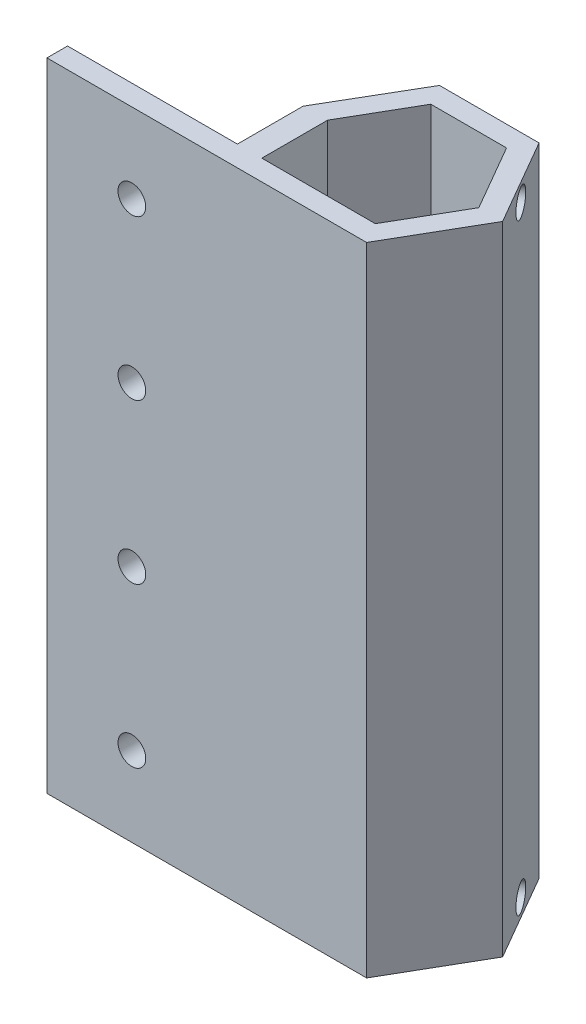
ISO-10303-21;
HEADER;
FILE_DESCRIPTION(('STEP AP214'),'2;1');
FILE_NAME('part.step','',(''),(''),'','','');
FILE_SCHEMA(('AUTOMOTIVE_DESIGN { 1 0 10303 214 1 1 1 1 }'));
ENDSEC;
DATA;
#1=APPLICATION_CONTEXT('core data for automotive mechanical design processes');
#2=APPLICATION_PROTOCOL_DEFINITION('international standard','automotive_design',2000,#1);
#3=PRODUCT_CONTEXT('',#1,'mechanical');
#4=PRODUCT('Part','Part','',(#3));
#5=PRODUCT_RELATED_PRODUCT_CATEGORY('part','',(#4));
#6=PRODUCT_DEFINITION_FORMATION('','',#4);
#7=PRODUCT_DEFINITION_CONTEXT('part definition',#1,'design');
#8=PRODUCT_DEFINITION('design','',#6,#7);
#9=PRODUCT_DEFINITION_SHAPE('','',#8);
#10=(LENGTH_UNIT() NAMED_UNIT(*) SI_UNIT(.MILLI.,.METRE.));
#11=(NAMED_UNIT(*) PLANE_ANGLE_UNIT() SI_UNIT($,.RADIAN.));
#12=(NAMED_UNIT(*) SI_UNIT($,.STERADIAN.) SOLID_ANGLE_UNIT());
#13=UNCERTAINTY_MEASURE_WITH_UNIT(LENGTH_MEASURE(1.E-05),#10,'distance_accuracy_value','');
#14=(GEOMETRIC_REPRESENTATION_CONTEXT(3) GLOBAL_UNCERTAINTY_ASSIGNED_CONTEXT((#13)) GLOBAL_UNIT_ASSIGNED_CONTEXT((#10,
#11,#12)) REPRESENTATION_CONTEXT('',''));
#15=CARTESIAN_POINT('',(0.,0.,0.));
#16=DIRECTION('',(0.,0.,1.));
#17=DIRECTION('',(1.,0.,0.));
#18=AXIS2_PLACEMENT_3D('',#15,#16,#17);
#19=CARTESIAN_POINT('',(17.8401233179594,-150.,0.));
#20=DIRECTION('',(0.866025403784439,0.,-0.5));
#21=DIRECTION('',(-0.5,0.,-0.866025403784439));
#22=AXIS2_PLACEMENT_3D('',#19,#20,#21);
#23=PLANE('',#22);
#24=DIRECTION('',(0.,1.,0.));
#25=VECTOR('',#24,1.);
#26=CARTESIAN_POINT('',(8.92006165897972,-150.,-15.45));
#27=LINE('',#26,#25);
#28=CARTESIAN_POINT('',(8.92006165897973,-122.7,-15.45));
#29=VERTEX_POINT('',#28);
#30=CARTESIAN_POINT('',(8.92006165897972,-27.2994247482094,-15.45));
#31=VERTEX_POINT('',#30);
#32=EDGE_CURVE('E60',#29,#31,#27,.T.);
#33=ORIENTED_EDGE('',*,*,#32,.F.);
#34=DIRECTION('',(0.5,0.,0.866025403784439));
#35=VECTOR('',#34,1.);
#36=CARTESIAN_POINT('',(17.8401233179594,-122.7,0.));
#37=LINE('',#36,#35);
#38=CARTESIAN_POINT('',(17.8401233179594,-122.7,0.));
#39=VERTEX_POINT('',#38);
#40=EDGE_CURVE('E454',#29,#39,#37,.T.);
#41=ORIENTED_EDGE('',*,*,#40,.T.);
#42=DIRECTION('',(0.,1.,0.));
#43=VECTOR('',#42,1.);
#44=CARTESIAN_POINT('',(17.8401233179594,-150.,0.));
#45=LINE('',#44,#43);
#46=CARTESIAN_POINT('',(17.8401233179594,-27.2994247482094,0.));
#47=VERTEX_POINT('',#46);
#48=EDGE_CURVE('E372',#39,#47,#45,.T.);
#49=ORIENTED_EDGE('',*,*,#48,.T.);
#50=DIRECTION('',(-0.5,0.,-0.866025403784439));
#51=VECTOR('',#50,1.);
#52=CARTESIAN_POINT('',(17.8401233179594,-27.2994247482094,0.));
#53=LINE('',#52,#51);
#54=EDGE_CURVE('E423',#47,#31,#53,.T.);
#55=ORIENTED_EDGE('',*,*,#54,.T.);
#56=EDGE_LOOP('',(#33,#41,#49,#55));
#57=FACE_BOUND('',#56,.T.);
#58=ADVANCED_FACE('F37',(#57),#23,.F.);
#59=CARTESIAN_POINT('',(13.3800924884696,-4.15,-7.725));
#60=DIRECTION('',(0.866025403784439,0.,-0.5));
#61=DIRECTION('',(-0.5,0.,-0.866025403784439));
#62=AXIS2_PLACEMENT_3D('',#59,#60,#61);
#63=CIRCLE('',#62,3.15);
#64=CARTESIAN_POINT('',(11.8050924884696,-4.15,-10.452980021921));
#65=VERTEX_POINT('',#64);
#66=EDGE_CURVE('E291',#65,#65,#63,.T.);
#67=ORIENTED_EDGE('',*,*,#66,.T.);
#68=EDGE_LOOP('',(#67));
#69=FACE_BOUND('',#68,.T.);
#70=CARTESIAN_POINT('',(8.92006165897973,-25.7,-15.45));
#71=VERTEX_POINT('',#70);
#72=CARTESIAN_POINT('',(8.92006165897972,0.,-15.45));
#73=VERTEX_POINT('',#72);
#74=EDGE_CURVE('E368',#71,#73,#27,.T.);
#75=ORIENTED_EDGE('',*,*,#74,.F.);
#76=DIRECTION('',(0.5,0.,0.866025403784439));
#77=VECTOR('',#76,1.);
#78=CARTESIAN_POINT('',(17.8401233179594,-25.7,0.));
#79=LINE('',#78,#77);
#80=CARTESIAN_POINT('',(17.8401233179594,-25.7,0.));
#81=VERTEX_POINT('',#80);
#82=EDGE_CURVE('E443',#71,#81,#79,.T.);
#83=ORIENTED_EDGE('',*,*,#82,.T.);
#84=CARTESIAN_POINT('',(17.8401233179594,0.,0.));
#85=VERTEX_POINT('',#84);
#86=EDGE_CURVE('E339',#81,#85,#45,.T.);
#87=ORIENTED_EDGE('',*,*,#86,.T.);
#88=DIRECTION('',(-0.5,0.,-0.866025403784439));
#89=VECTOR('',#88,1.);
#90=CARTESIAN_POINT('',(17.8401233179594,0.,0.));
#91=LINE('',#90,#89);
#92=EDGE_CURVE('E342',#85,#73,#91,.T.);
#93=ORIENTED_EDGE('',*,*,#92,.T.);
#94=EDGE_LOOP('',(#75,#83,#87,#93));
#95=FACE_BOUND('',#94,.T.);
#96=ADVANCED_FACE('F470',(#69,#95),#23,.F.);
#97=CARTESIAN_POINT('',(11.7217117339614,-150.,20.3026002748974));
#98=DIRECTION('',(0.866025403784439,0.,0.5));
#99=DIRECTION('',(0.5,0.,-0.866025403784439));
#100=AXIS2_PLACEMENT_3D('',#97,#98,#99);
#101=PLANE('',#100);
#102=DIRECTION('',(0.5,0.,-0.866025403784439));
#103=VECTOR('',#102,1.);
#104=CARTESIAN_POINT('',(11.7217117339614,0.,20.3026002748974));
#105=LINE('',#104,#103);
#106=CARTESIAN_POINT('',(11.7217117339614,0.,20.3026002748974));
#107=VERTEX_POINT('',#106);
#108=CARTESIAN_POINT('',(23.4434234679228,0.,0.));
#109=VERTEX_POINT('',#108);
#110=EDGE_CURVE('E358',#107,#109,#105,.T.);
#111=ORIENTED_EDGE('',*,*,#110,.F.);
#112=DIRECTION('',(0.,1.,0.));
#113=VECTOR('',#112,1.);
#114=CARTESIAN_POINT('',(11.7217117339614,-150.,20.3026002748974));
#115=LINE('',#114,#113);
#116=CARTESIAN_POINT('',(11.7217117339614,-150.,20.3026002748974));
#117=VERTEX_POINT('',#116);
#118=EDGE_CURVE('E421',#117,#107,#115,.T.);
#119=ORIENTED_EDGE('',*,*,#118,.F.);
#120=DIRECTION('',(0.5,0.,-0.866025403784439));
#121=VECTOR('',#120,1.);
#122=CARTESIAN_POINT('',(11.7217117339614,-150.,20.3026002748974));
#123=LINE('',#122,#121);
#124=CARTESIAN_POINT('',(23.4434234679228,-150.,0.));
#125=VERTEX_POINT('',#124);
#126=EDGE_CURVE('E373',#117,#125,#123,.T.);
#127=ORIENTED_EDGE('',*,*,#126,.T.);
#128=DIRECTION('',(0.,1.,0.));
#129=VECTOR('',#128,1.);
#130=CARTESIAN_POINT('',(23.4434234679228,-150.,0.));
#131=LINE('',#130,#129);
#132=EDGE_CURVE('E398',#125,#109,#131,.T.);
#133=ORIENTED_EDGE('',*,*,#132,.T.);
#134=EDGE_LOOP('',(#111,#119,#127,#133));
#135=FACE_BOUND('',#134,.T.);
#136=ADVANCED_FACE('F39',(#135),#101,.T.);
#137=CARTESIAN_POINT('',(-63.5573922523487,-150.,20.3026002748974));
#138=DIRECTION('',(0.,0.,1.));
#139=DIRECTION('',(1.,0.,0.));
#140=AXIS2_PLACEMENT_3D('',#137,#138,#139);
#141=PLANE('',#140);
#142=CARTESIAN_POINT('',(-43.5573922523487,-131.25,20.3026002748974));
#143=DIRECTION('',(0.,0.,1.));
#144=DIRECTION('',(1.,0.,0.));
#145=AXIS2_PLACEMENT_3D('',#142,#143,#144);
#146=CIRCLE('',#145,3.2639);
#147=CARTESIAN_POINT('',(-40.2934922523487,-131.25,20.3026002748974));
#148=VERTEX_POINT('',#147);
#149=EDGE_CURVE('E316',#148,#148,#146,.T.);
#150=ORIENTED_EDGE('',*,*,#149,.F.);
#151=EDGE_LOOP('',(#150));
#152=FACE_BOUND('',#151,.T.);
#153=CARTESIAN_POINT('',(-43.5573922523487,-93.75,20.3026002748974));
#154=DIRECTION('',(0.,0.,1.));
#155=DIRECTION('',(1.,0.,0.));
#156=AXIS2_PLACEMENT_3D('',#153,#154,#155);
#157=CIRCLE('',#156,3.2639);
#158=CARTESIAN_POINT('',(-40.2934922523487,-93.75,20.3026002748974));
#159=VERTEX_POINT('',#158);
#160=EDGE_CURVE('E313',#159,#159,#157,.T.);
#161=ORIENTED_EDGE('',*,*,#160,.F.);
#162=EDGE_LOOP('',(#161));
#163=FACE_BOUND('',#162,.T.);
#164=CARTESIAN_POINT('',(-43.5573922523487,-56.25,20.3026002748974));
#165=DIRECTION('',(0.,0.,1.));
#166=DIRECTION('',(1.,0.,0.));
#167=AXIS2_PLACEMENT_3D('',#164,#165,#166);
#168=CIRCLE('',#167,3.2639);
#169=CARTESIAN_POINT('',(-40.2934922523487,-56.25,20.3026002748974));
#170=VERTEX_POINT('',#169);
#171=EDGE_CURVE('E310',#170,#170,#168,.T.);
#172=ORIENTED_EDGE('',*,*,#171,.F.);
#173=EDGE_LOOP('',(#172));
#174=FACE_BOUND('',#173,.T.);
#175=CARTESIAN_POINT('',(-43.5573922523487,-18.75,20.3026002748974));
#176=DIRECTION('',(0.,0.,1.));
#177=DIRECTION('',(1.,0.,0.));
#178=AXIS2_PLACEMENT_3D('',#175,#176,#177);
#179=CIRCLE('',#178,3.2639);
#180=CARTESIAN_POINT('',(-40.2934922523487,-18.75,20.3026002748974));
#181=VERTEX_POINT('',#180);
#182=EDGE_CURVE('E297',#181,#181,#179,.T.);
#183=ORIENTED_EDGE('',*,*,#182,.F.);
#184=EDGE_LOOP('',(#183));
#185=FACE_BOUND('',#184,.T.);
#186=DIRECTION('',(1.,0.,0.));
#187=VECTOR('',#186,1.);
#188=CARTESIAN_POINT('',(-63.5573922523487,0.,20.3026002748974));
#189=LINE('',#188,#187);
#190=CARTESIAN_POINT('',(-63.5573922523487,0.,20.3026002748974));
#191=VERTEX_POINT('',#190);
#192=EDGE_CURVE('E377',#191,#107,#189,.T.);
#193=ORIENTED_EDGE('',*,*,#192,.F.);
#194=DIRECTION('',(0.,1.,0.));
#195=VECTOR('',#194,1.);
#196=CARTESIAN_POINT('',(-63.5573922523487,-150.,20.3026002748974));
#197=LINE('',#196,#195);
#198=CARTESIAN_POINT('',(-63.5573922523487,-150.,20.3026002748974));
#199=VERTEX_POINT('',#198);
#200=EDGE_CURVE('E424',#199,#191,#197,.T.);
#201=ORIENTED_EDGE('',*,*,#200,.F.);
#202=DIRECTION('',(1.,0.,0.));
#203=VECTOR('',#202,1.);
#204=CARTESIAN_POINT('',(-63.5573922523487,-150.,20.3026002748974));
#205=LINE('',#204,#203);
#206=EDGE_CURVE('E395',#199,#117,#205,.T.);
#207=ORIENTED_EDGE('',*,*,#206,.T.);
#208=ORIENTED_EDGE('',*,*,#118,.T.);
#209=EDGE_LOOP('',(#193,#201,#207,#208));
#210=FACE_BOUND('',#209,.T.);
#211=ADVANCED_FACE('F679',(#152,#163,#174,#185,#210),#141,.T.);
#212=CARTESIAN_POINT('',(-63.5573922523487,-150.,20.3026002748974));
#213=DIRECTION('',(-1.,0.,0.));
#214=DIRECTION('',(0.,0.,1.));
#215=AXIS2_PLACEMENT_3D('',#212,#213,#214);
#216=PLANE('',#215);
#217=DIRECTION('',(0.,0.,1.));
#218=VECTOR('',#217,1.);
#219=CARTESIAN_POINT('',(-63.5573922523487,0.,20.3026002748974));
#220=LINE('',#219,#218);
#221=CARTESIAN_POINT('',(-63.5573922523487,0.,15.4526002748974));
#222=VERTEX_POINT('',#221);
#223=EDGE_CURVE('E416',#222,#191,#220,.T.);
#224=ORIENTED_EDGE('',*,*,#223,.F.);
#225=DIRECTION('',(0.,1.,0.));
#226=VECTOR('',#225,1.);
#227=CARTESIAN_POINT('',(-63.5573922523487,-150.,15.4526002748974));
#228=LINE('',#227,#226);
#229=CARTESIAN_POINT('',(-63.5573922523487,-150.,15.4526002748974));
#230=VERTEX_POINT('',#229);
#231=EDGE_CURVE('E426',#230,#222,#228,.T.);
#232=ORIENTED_EDGE('',*,*,#231,.F.);
#233=DIRECTION('',(0.,0.,1.));
#234=VECTOR('',#233,1.);
#235=CARTESIAN_POINT('',(-63.5573922523487,-150.,20.3026002748974));
#236=LINE('',#235,#234);
#237=EDGE_CURVE('E392',#230,#199,#236,.T.);
#238=ORIENTED_EDGE('',*,*,#237,.T.);
#239=ORIENTED_EDGE('',*,*,#200,.T.);
#240=EDGE_LOOP('',(#224,#232,#238,#239));
#241=FACE_BOUND('',#240,.T.);
#242=ADVANCED_FACE('F736',(#241),#216,.T.);
#243=CARTESIAN_POINT('',(-23.5573922523487,-150.,15.4526002748974));
#244=DIRECTION('',(0.,0.,-1.));
#245=DIRECTION('',(-1.,0.,0.));
#246=AXIS2_PLACEMENT_3D('',#243,#244,#245);
#247=PLANE('',#246);
#248=CARTESIAN_POINT('',(-43.5573922523487,-131.25,15.4526002748974));
#249=DIRECTION('',(0.,0.,-1.));
#250=DIRECTION('',(-1.,0.,0.));
#251=AXIS2_PLACEMENT_3D('',#248,#249,#250);
#252=CIRCLE('',#251,3.2639);
#253=CARTESIAN_POINT('',(-46.8212922523487,-131.25,15.4526002748974));
#254=VERTEX_POINT('',#253);
#255=EDGE_CURVE('E294',#254,#254,#252,.T.);
#256=ORIENTED_EDGE('',*,*,#255,.F.);
#257=EDGE_LOOP('',(#256));
#258=FACE_BOUND('',#257,.T.);
#259=CARTESIAN_POINT('',(-43.5573922523487,-93.75,15.4526002748974));
#260=DIRECTION('',(0.,0.,-1.));
#261=DIRECTION('',(-1.,0.,0.));
#262=AXIS2_PLACEMENT_3D('',#259,#260,#261);
#263=CIRCLE('',#262,3.2639);
#264=CARTESIAN_POINT('',(-46.8212922523487,-93.75,15.4526002748974));
#265=VERTEX_POINT('',#264);
#266=EDGE_CURVE('E298',#265,#265,#263,.T.);
#267=ORIENTED_EDGE('',*,*,#266,.F.);
#268=EDGE_LOOP('',(#267));
#269=FACE_BOUND('',#268,.T.);
#270=CARTESIAN_POINT('',(-43.5573922523487,-56.25,15.4526002748974));
#271=DIRECTION('',(0.,0.,-1.));
#272=DIRECTION('',(-1.,0.,0.));
#273=AXIS2_PLACEMENT_3D('',#270,#271,#272);
#274=CIRCLE('',#273,3.2639);
#275=CARTESIAN_POINT('',(-46.8212922523487,-56.25,15.4526002748974));
#276=VERTEX_POINT('',#275);
#277=EDGE_CURVE('E301',#276,#276,#274,.T.);
#278=ORIENTED_EDGE('',*,*,#277,.F.);
#279=EDGE_LOOP('',(#278));
#280=FACE_BOUND('',#279,.T.);
#281=CARTESIAN_POINT('',(-43.5573922523487,-18.75,15.4526002748974));
#282=DIRECTION('',(0.,0.,-1.));
#283=DIRECTION('',(-1.,0.,0.));
#284=AXIS2_PLACEMENT_3D('',#281,#282,#283);
#285=CIRCLE('',#284,3.2639);
#286=CARTESIAN_POINT('',(-46.8212922523487,-18.75,15.4526002748974));
#287=VERTEX_POINT('',#286);
#288=EDGE_CURVE('E304',#287,#287,#285,.T.);
#289=ORIENTED_EDGE('',*,*,#288,.F.);
#290=EDGE_LOOP('',(#289));
#291=FACE_BOUND('',#290,.T.);
#292=DIRECTION('',(-1.,0.,0.));
#293=VECTOR('',#292,1.);
#294=CARTESIAN_POINT('',(-23.5573922523487,0.,15.4526002748974));
#295=LINE('',#294,#293);
#296=CARTESIAN_POINT('',(-23.5573922523487,0.,15.4526002748974));
#297=VERTEX_POINT('',#296);
#298=EDGE_CURVE('E413',#297,#222,#295,.T.);
#299=ORIENTED_EDGE('',*,*,#298,.F.);
#300=DIRECTION('',(0.,1.,0.));
#301=VECTOR('',#300,1.);
#302=CARTESIAN_POINT('',(-23.5573922523487,-150.,15.4526002748974));
#303=LINE('',#302,#301);
#304=CARTESIAN_POINT('',(-23.5573922523487,-150.,15.4526002748974));
#305=VERTEX_POINT('',#304);
#306=EDGE_CURVE('E428',#305,#297,#303,.T.);
#307=ORIENTED_EDGE('',*,*,#306,.F.);
#308=DIRECTION('',(-1.,0.,0.));
#309=VECTOR('',#308,1.);
#310=CARTESIAN_POINT('',(-23.5573922523487,-150.,15.4526002748974));
#311=LINE('',#310,#309);
#312=EDGE_CURVE('E389',#305,#230,#311,.T.);
#313=ORIENTED_EDGE('',*,*,#312,.T.);
#314=ORIENTED_EDGE('',*,*,#231,.T.);
#315=EDGE_LOOP('',(#299,#307,#313,#314));
#316=FACE_BOUND('',#315,.T.);
#317=ADVANCED_FACE('F730',(#258,#269,#280,#291,#316),#247,.T.);
#318=CARTESIAN_POINT('',(-23.5573922523487,-150.,-0.00260027489742271));
#319=DIRECTION('',(-1.,0.,0.));
#320=DIRECTION('',(0.,0.,1.));
#321=AXIS2_PLACEMENT_3D('',#318,#319,#320);
#322=PLANE('',#321);
#323=DIRECTION('',(0.,0.,1.));
#324=VECTOR('',#323,1.);
#325=CARTESIAN_POINT('',(-23.5573922523487,0.,-0.00260027489742271));
#326=LINE('',#325,#324);
#327=CARTESIAN_POINT('',(-23.5573922523487,0.,-0.00260027489742271));
#328=VERTEX_POINT('',#327);
#329=EDGE_CURVE('E410',#328,#297,#326,.T.);
#330=ORIENTED_EDGE('',*,*,#329,.F.);
#331=DIRECTION('',(0.,1.,0.));
#332=VECTOR('',#331,1.);
#333=CARTESIAN_POINT('',(-23.5573922523487,-150.,-0.00260027489742271));
#334=LINE('',#333,#332);
#335=CARTESIAN_POINT('',(-23.5573922523487,-150.,-0.00260027489742271));
#336=VERTEX_POINT('',#335);
#337=EDGE_CURVE('E430',#336,#328,#334,.T.);
#338=ORIENTED_EDGE('',*,*,#337,.F.);
#339=DIRECTION('',(0.,0.,1.));
#340=VECTOR('',#339,1.);
#341=CARTESIAN_POINT('',(-23.5573922523487,-150.,-0.00260027489742271));
#342=LINE('',#341,#340);
#343=EDGE_CURVE('E386',#336,#305,#342,.T.);
#344=ORIENTED_EDGE('',*,*,#343,.T.);
#345=ORIENTED_EDGE('',*,*,#306,.T.);
#346=EDGE_LOOP('',(#330,#338,#344,#345));
#347=FACE_BOUND('',#346,.T.);
#348=ADVANCED_FACE('F735',(#347),#322,.T.);
#349=CARTESIAN_POINT('',(-11.7217117339614,-150.,-20.3026002748974));
#350=DIRECTION('',(-0.863889754501286,0.,-0.503680942728339));
#351=DIRECTION('',(-0.503680942728339,0.,0.863889754501286));
#352=AXIS2_PLACEMENT_3D('',#349,#350,#351);
#353=PLANE('',#352);
#354=DIRECTION('',(-0.503680942728339,0.,0.863889754501286));
#355=VECTOR('',#354,1.);
#356=CARTESIAN_POINT('',(-11.7217117339614,0.,-20.3026002748974));
#357=LINE('',#356,#355);
#358=CARTESIAN_POINT('',(-11.7217117339614,0.,-20.3026002748974));
#359=VERTEX_POINT('',#358);
#360=EDGE_CURVE('E407',#359,#328,#357,.T.);
#361=ORIENTED_EDGE('',*,*,#360,.F.);
#362=DIRECTION('',(0.,1.,0.));
#363=VECTOR('',#362,1.);
#364=CARTESIAN_POINT('',(-11.7217117339614,-150.,-20.3026002748974));
#365=LINE('',#364,#363);
#366=CARTESIAN_POINT('',(-11.7217117339614,-150.,-20.3026002748974));
#367=VERTEX_POINT('',#366);
#368=EDGE_CURVE('E432',#367,#359,#365,.T.);
#369=ORIENTED_EDGE('',*,*,#368,.F.);
#370=DIRECTION('',(-0.503680942728339,0.,0.863889754501286));
#371=VECTOR('',#370,1.);
#372=CARTESIAN_POINT('',(-11.7217117339614,-150.,-20.3026002748974));
#373=LINE('',#372,#371);
#374=EDGE_CURVE('E383',#367,#336,#373,.T.);
#375=ORIENTED_EDGE('',*,*,#374,.T.);
#376=ORIENTED_EDGE('',*,*,#337,.T.);
#377=EDGE_LOOP('',(#361,#369,#375,#376));
#378=FACE_BOUND('',#377,.T.);
#379=ADVANCED_FACE('F667',(#378),#353,.T.);
#380=CARTESIAN_POINT('',(11.7217117339614,-150.,-20.3026002748974));
#381=DIRECTION('',(0.,0.,-1.));
#382=DIRECTION('',(-1.,0.,0.));
#383=AXIS2_PLACEMENT_3D('',#380,#381,#382);
#384=PLANE('',#383);
#385=DIRECTION('',(-1.,0.,0.));
#386=VECTOR('',#385,1.);
#387=CARTESIAN_POINT('',(11.7217117339614,0.,-20.3026002748974));
#388=LINE('',#387,#386);
#389=CARTESIAN_POINT('',(11.7217117339614,0.,-20.3026002748974));
#390=VERTEX_POINT('',#389);
#391=EDGE_CURVE('E404',#390,#359,#388,.T.);
#392=ORIENTED_EDGE('',*,*,#391,.F.);
#393=DIRECTION('',(0.,1.,0.));
#394=VECTOR('',#393,1.);
#395=CARTESIAN_POINT('',(11.7217117339614,-150.,-20.3026002748974));
#396=LINE('',#395,#394);
#397=CARTESIAN_POINT('',(11.7217117339614,-150.,-20.3026002748974));
#398=VERTEX_POINT('',#397);
#399=EDGE_CURVE('E434',#398,#390,#396,.T.);
#400=ORIENTED_EDGE('',*,*,#399,.F.);
#401=DIRECTION('',(-1.,0.,0.));
#402=VECTOR('',#401,1.);
#403=CARTESIAN_POINT('',(11.7217117339614,-150.,-20.3026002748974));
#404=LINE('',#403,#402);
#405=EDGE_CURVE('E380',#398,#367,#404,.T.);
#406=ORIENTED_EDGE('',*,*,#405,.T.);
#407=ORIENTED_EDGE('',*,*,#368,.T.);
#408=EDGE_LOOP('',(#392,#400,#406,#407));
#409=FACE_BOUND('',#408,.T.);
#410=ADVANCED_FACE('F656',(#409),#384,.T.);
#411=CARTESIAN_POINT('',(23.4434234679228,-150.,0.));
#412=DIRECTION('',(0.866025403784439,0.,-0.5));
#413=DIRECTION('',(-0.5,0.,-0.866025403784439));
#414=AXIS2_PLACEMENT_3D('',#411,#412,#413);
#415=PLANE('',#414);
#416=ORIENTED_EDGE('',*,*,#399,.T.);
#417=DIRECTION('',(-0.5,0.,-0.866025403784439));
#418=VECTOR('',#417,1.);
#419=CARTESIAN_POINT('',(23.4434234679228,0.,0.));
#420=LINE('',#419,#418);
#421=EDGE_CURVE('E401',#109,#390,#420,.T.);
#422=ORIENTED_EDGE('',*,*,#421,.F.);
#423=ORIENTED_EDGE('',*,*,#132,.F.);
#424=DIRECTION('',(-0.5,0.,-0.866025403784439));
#425=VECTOR('',#424,1.);
#426=CARTESIAN_POINT('',(23.4434234679228,-150.,0.));
#427=LINE('',#426,#425);
#428=EDGE_CURVE('E376',#125,#398,#427,.T.);
#429=ORIENTED_EDGE('',*,*,#428,.T.);
#430=EDGE_LOOP('',(#416,#422,#423,#429));
#431=FACE_BOUND('',#430,.T.);
#432=CARTESIAN_POINT('',(17.5825676009421,-145.85,-10.1513001374487));
#433=DIRECTION('',(0.866025403784439,0.,-0.5));
#434=DIRECTION('',(-0.5,0.,-0.866025403784439));
#435=AXIS2_PLACEMENT_3D('',#432,#433,#434);
#436=CIRCLE('',#435,3.15);
#437=CARTESIAN_POINT('',(16.0075676009421,-145.85,-12.8792801593697));
#438=VERTEX_POINT('',#437);
#439=EDGE_CURVE('E288',#438,#438,#436,.T.);
#440=ORIENTED_EDGE('',*,*,#439,.F.);
#441=EDGE_LOOP('',(#440));
#442=FACE_BOUND('',#441,.T.);
#443=CARTESIAN_POINT('',(17.5825676009421,-4.15,-10.1513001374487));
#444=DIRECTION('',(0.866025403784439,0.,-0.5));
#445=DIRECTION('',(-0.5,0.,-0.866025403784439));
#446=AXIS2_PLACEMENT_3D('',#443,#444,#445);
#447=CIRCLE('',#446,3.15);
#448=CARTESIAN_POINT('',(16.0075676009421,-4.15,-12.8792801593697));
#449=VERTEX_POINT('',#448);
#450=EDGE_CURVE('E287',#449,#449,#447,.T.);
#451=ORIENTED_EDGE('',*,*,#450,.F.);
#452=EDGE_LOOP('',(#451));
#453=FACE_BOUND('',#452,.T.);
#454=ADVANCED_FACE('F651',(#431,#442,#453),#415,.T.);
#455=CARTESIAN_POINT('',(0.,-150.,0.));
#456=DIRECTION('',(0.,1.,0.));
#457=DIRECTION('',(0.,0.,1.));
#458=AXIS2_PLACEMENT_3D('',#455,#456,#457);
#459=PLANE('',#458);
#460=DIRECTION('',(1.,0.,0.));
#461=VECTOR('',#460,1.);
#462=CARTESIAN_POINT('',(-17.8112558044999,-150.,15.45));
#463=LINE('',#462,#461);
#464=CARTESIAN_POINT('',(-17.8112558044999,-150.,15.45));
#465=VERTEX_POINT('',#464);
#466=CARTESIAN_POINT('',(8.92006165897971,-150.,15.45));
#467=VERTEX_POINT('',#466);
#468=EDGE_CURVE('E336',#465,#467,#463,.T.);
#469=ORIENTED_EDGE('',*,*,#468,.T.);
#470=DIRECTION('',(0.5,0.,-0.866025403784439));
#471=VECTOR('',#470,1.);
#472=CARTESIAN_POINT('',(8.92006165897971,-150.,15.45));
#473=LINE('',#472,#471);
#474=CARTESIAN_POINT('',(17.8401233179594,-150.,0.));
#475=VERTEX_POINT('',#474);
#476=EDGE_CURVE('E320',#467,#475,#473,.T.);
#477=ORIENTED_EDGE('',*,*,#476,.T.);
#478=DIRECTION('',(-0.5,0.,-0.866025403784439));
#479=VECTOR('',#478,1.);
#480=CARTESIAN_POINT('',(17.8401233179594,-150.,0.));
#481=LINE('',#480,#479);
#482=CARTESIAN_POINT('',(8.92006165897973,-150.,-15.45));
#483=VERTEX_POINT('',#482);
#484=EDGE_CURVE('E323',#475,#483,#481,.T.);
#485=ORIENTED_EDGE('',*,*,#484,.T.);
#486=DIRECTION('',(-1.,0.,0.));
#487=VECTOR('',#486,1.);
#488=CARTESIAN_POINT('',(8.92006165897972,-150.,-15.45));
#489=LINE('',#488,#487);
#490=CARTESIAN_POINT('',(-8.92006165897972,-150.,-15.45));
#491=VERTEX_POINT('',#490);
#492=EDGE_CURVE('E327',#483,#491,#489,.T.);
#493=ORIENTED_EDGE('',*,*,#492,.T.);
#494=DIRECTION('',(-0.5,0.,0.866025403784439));
#495=VECTOR('',#494,1.);
#496=CARTESIAN_POINT('',(-8.92006165897972,-150.,-15.45));
#497=LINE('',#496,#495);
#498=CARTESIAN_POINT('',(-17.8112558045,-150.,-0.05));
#499=VERTEX_POINT('',#498);
#500=EDGE_CURVE('E330',#491,#499,#497,.T.);
#501=ORIENTED_EDGE('',*,*,#500,.T.);
#502=DIRECTION('',(0.,0.,1.));
#503=VECTOR('',#502,1.);
#504=CARTESIAN_POINT('',(-17.8112558045,-150.,-0.05));
#505=LINE('',#504,#503);
#506=EDGE_CURVE('E333',#499,#465,#505,.T.);
#507=ORIENTED_EDGE('',*,*,#506,.T.);
#508=EDGE_LOOP('',(#469,#477,#485,#493,#501,#507));
#509=FACE_BOUND('',#508,.T.);
#510=ORIENTED_EDGE('',*,*,#126,.F.);
#511=ORIENTED_EDGE('',*,*,#206,.F.);
#512=ORIENTED_EDGE('',*,*,#237,.F.);
#513=ORIENTED_EDGE('',*,*,#312,.F.);
#514=ORIENTED_EDGE('',*,*,#343,.F.);
#515=ORIENTED_EDGE('',*,*,#374,.F.);
#516=ORIENTED_EDGE('',*,*,#405,.F.);
#517=ORIENTED_EDGE('',*,*,#428,.F.);
#518=EDGE_LOOP('',(#510,#511,#512,#513,#514,#515,#516,#517));
#519=FACE_BOUND('',#518,.T.);
#520=ADVANCED_FACE('F532',(#509,#519),#459,.F.);
#521=CARTESIAN_POINT('',(0.,0.,0.));
#522=DIRECTION('',(0.,1.,0.));
#523=DIRECTION('',(0.,0.,1.));
#524=AXIS2_PLACEMENT_3D('',#521,#522,#523);
#525=PLANE('',#524);
#526=DIRECTION('',(0.5,0.,-0.866025403784439));
#527=VECTOR('',#526,1.);
#528=CARTESIAN_POINT('',(8.92006165897971,0.,15.45));
#529=LINE('',#528,#527);
#530=CARTESIAN_POINT('',(8.92006165897971,0.,15.45));
#531=VERTEX_POINT('',#530);
#532=EDGE_CURVE('E319',#531,#85,#529,.T.);
#533=ORIENTED_EDGE('',*,*,#532,.F.);
#534=DIRECTION('',(1.,0.,0.));
#535=VECTOR('',#534,1.);
#536=CARTESIAN_POINT('',(-17.8112558044999,0.,15.45));
#537=LINE('',#536,#535);
#538=CARTESIAN_POINT('',(-17.8112558044999,0.,15.45));
#539=VERTEX_POINT('',#538);
#540=EDGE_CURVE('E324',#539,#531,#537,.T.);
#541=ORIENTED_EDGE('',*,*,#540,.F.);
#542=DIRECTION('',(0.,0.,1.));
#543=VECTOR('',#542,1.);
#544=CARTESIAN_POINT('',(-17.8112558045,0.,-0.05));
#545=LINE('',#544,#543);
#546=CARTESIAN_POINT('',(-17.8112558045,0.,-0.05));
#547=VERTEX_POINT('',#546);
#548=EDGE_CURVE('E351',#547,#539,#545,.T.);
#549=ORIENTED_EDGE('',*,*,#548,.F.);
#550=DIRECTION('',(-0.5,0.,0.866025403784439));
#551=VECTOR('',#550,1.);
#552=CARTESIAN_POINT('',(-8.92006165897972,0.,-15.45));
#553=LINE('',#552,#551);
#554=CARTESIAN_POINT('',(-8.92006165897972,0.,-15.45));
#555=VERTEX_POINT('',#554);
#556=EDGE_CURVE('E348',#555,#547,#553,.T.);
#557=ORIENTED_EDGE('',*,*,#556,.F.);
#558=DIRECTION('',(-1.,0.,0.));
#559=VECTOR('',#558,1.);
#560=CARTESIAN_POINT('',(8.92006165897972,0.,-15.45));
#561=LINE('',#560,#559);
#562=EDGE_CURVE('E345',#73,#555,#561,.T.);
#563=ORIENTED_EDGE('',*,*,#562,.F.);
#564=ORIENTED_EDGE('',*,*,#92,.F.);
#565=EDGE_LOOP('',(#533,#541,#549,#557,#563,#564));
#566=FACE_BOUND('',#565,.T.);
#567=ORIENTED_EDGE('',*,*,#110,.T.);
#568=ORIENTED_EDGE('',*,*,#421,.T.);
#569=ORIENTED_EDGE('',*,*,#391,.T.);
#570=ORIENTED_EDGE('',*,*,#360,.T.);
#571=ORIENTED_EDGE('',*,*,#329,.T.);
#572=ORIENTED_EDGE('',*,*,#298,.T.);
#573=ORIENTED_EDGE('',*,*,#223,.T.);
#574=ORIENTED_EDGE('',*,*,#192,.T.);
#575=EDGE_LOOP('',(#567,#568,#569,#570,#571,#572,#573,#574));
#576=FACE_BOUND('',#575,.T.);
#577=ADVANCED_FACE('F477',(#566,#576),#525,.T.);
#578=CARTESIAN_POINT('',(8.92006165897971,-150.,15.45));
#579=DIRECTION('',(0.866025403784439,0.,0.5));
#580=DIRECTION('',(0.5,0.,-0.866025403784439));
#581=AXIS2_PLACEMENT_3D('',#578,#579,#580);
#582=PLANE('',#581);
#583=ORIENTED_EDGE('',*,*,#48,.F.);
#584=DIRECTION('',(-0.5,0.,0.866025403784439));
#585=VECTOR('',#584,1.);
#586=CARTESIAN_POINT('',(8.92006165897971,-122.7,15.45));
#587=LINE('',#586,#585);
#588=CARTESIAN_POINT('',(15.0384732429778,-122.7,4.8526002748974));
#589=VERTEX_POINT('',#588);
#590=EDGE_CURVE('E249',#39,#589,#587,.T.);
#591=ORIENTED_EDGE('',*,*,#590,.T.);
#592=DIRECTION('',(0.,-1.,0.));
#593=VECTOR('',#592,1.);
#594=CARTESIAN_POINT('',(15.0384732429778,-150.,4.85260027489742));
#595=LINE('',#594,#593);
#596=CARTESIAN_POINT('',(15.0384732429778,-124.3,4.8526002748974));
#597=VERTEX_POINT('',#596);
#598=EDGE_CURVE('E11',#589,#597,#595,.T.);
#599=ORIENTED_EDGE('',*,*,#598,.T.);
#600=DIRECTION('',(0.5,0.,-0.866025403784439));
#601=VECTOR('',#600,1.);
#602=CARTESIAN_POINT('',(8.92006165897971,-124.3,15.45));
#603=LINE('',#602,#601);
#604=CARTESIAN_POINT('',(17.8401233179594,-124.3,0.));
#605=VERTEX_POINT('',#604);
#606=EDGE_CURVE('E217',#597,#605,#603,.T.);
#607=ORIENTED_EDGE('',*,*,#606,.T.);
#608=EDGE_CURVE('E369',#475,#605,#45,.T.);
#609=ORIENTED_EDGE('',*,*,#608,.F.);
#610=ORIENTED_EDGE('',*,*,#476,.F.);
#611=DIRECTION('',(0.,1.,0.));
#612=VECTOR('',#611,1.);
#613=CARTESIAN_POINT('',(8.92006165897971,-150.,15.45));
#614=LINE('',#613,#612);
#615=EDGE_CURVE('E356',#467,#531,#614,.T.);
#616=ORIENTED_EDGE('',*,*,#615,.T.);
#617=ORIENTED_EDGE('',*,*,#532,.T.);
#618=ORIENTED_EDGE('',*,*,#86,.F.);
#619=DIRECTION('',(-0.5,0.,0.866025403784439));
#620=VECTOR('',#619,1.);
#621=CARTESIAN_POINT('',(8.92006165897971,-25.7,15.45));
#622=LINE('',#621,#620);
#623=CARTESIAN_POINT('',(15.0384732429778,-25.7,4.8526002748974));
#624=VERTEX_POINT('',#623);
#625=EDGE_CURVE('E284',#81,#624,#622,.T.);
#626=ORIENTED_EDGE('',*,*,#625,.T.);
#627=DIRECTION('',(0.,-1.,0.));
#628=VECTOR('',#627,1.);
#629=CARTESIAN_POINT('',(15.0384732429778,-150.,4.85260027489742));
#630=LINE('',#629,#628);
#631=CARTESIAN_POINT('',(15.0384732429778,-27.2994247482094,4.8526002748974));
#632=VERTEX_POINT('',#631);
#633=EDGE_CURVE('E449',#624,#632,#630,.T.);
#634=ORIENTED_EDGE('',*,*,#633,.T.);
#635=DIRECTION('',(0.5,0.,-0.866025403784439));
#636=VECTOR('',#635,1.);
#637=CARTESIAN_POINT('',(8.92006165897971,-27.2994247482094,15.45));
#638=LINE('',#637,#636);
#639=EDGE_CURVE('E278',#632,#47,#638,.T.);
#640=ORIENTED_EDGE('',*,*,#639,.T.);
#641=EDGE_LOOP('',(#583,#591,#599,#607,#609,#610,#616,#617,#618,#626,#634,#640));
#642=FACE_BOUND('',#641,.T.);
#643=ADVANCED_FACE('F466',(#642),#582,.F.);
#644=CARTESIAN_POINT('',(-17.8112558044999,-150.,15.45));
#645=DIRECTION('',(0.,0.,1.));
#646=DIRECTION('',(1.,0.,0.));
#647=AXIS2_PLACEMENT_3D('',#644,#645,#646);
#648=PLANE('',#647);
#649=ORIENTED_EDGE('',*,*,#540,.T.);
#650=ORIENTED_EDGE('',*,*,#615,.F.);
#651=ORIENTED_EDGE('',*,*,#468,.F.);
#652=DIRECTION('',(0.,1.,0.));
#653=VECTOR('',#652,1.);
#654=CARTESIAN_POINT('',(-17.8112558044999,-150.,15.45));
#655=LINE('',#654,#653);
#656=EDGE_CURVE('E359',#465,#539,#655,.T.);
#657=ORIENTED_EDGE('',*,*,#656,.T.);
#658=EDGE_LOOP('',(#649,#650,#651,#657));
#659=FACE_BOUND('',#658,.T.);
#660=ADVANCED_FACE('F536',(#659),#648,.F.);
#661=CARTESIAN_POINT('',(-17.8112558045,-150.,-0.05));
#662=DIRECTION('',(-1.,0.,0.));
#663=DIRECTION('',(0.,0.,1.));
#664=AXIS2_PLACEMENT_3D('',#661,#662,#663);
#665=PLANE('',#664);
#666=ORIENTED_EDGE('',*,*,#548,.T.);
#667=ORIENTED_EDGE('',*,*,#656,.F.);
#668=ORIENTED_EDGE('',*,*,#506,.F.);
#669=DIRECTION('',(0.,1.,0.));
#670=VECTOR('',#669,1.);
#671=CARTESIAN_POINT('',(-17.8112558045,-150.,-0.05));
#672=LINE('',#671,#670);
#673=EDGE_CURVE('E361',#499,#547,#672,.T.);
#674=ORIENTED_EDGE('',*,*,#673,.T.);
#675=EDGE_LOOP('',(#666,#667,#668,#674));
#676=FACE_BOUND('',#675,.T.);
#677=ADVANCED_FACE('F538',(#676),#665,.F.);
#678=CARTESIAN_POINT('',(-8.92006165897972,-150.,-15.45));
#679=DIRECTION('',(-0.866025403784439,0.,-0.5));
#680=DIRECTION('',(-0.5,0.,0.866025403784439));
#681=AXIS2_PLACEMENT_3D('',#678,#679,#680);
#682=PLANE('',#681);
#683=ORIENTED_EDGE('',*,*,#556,.T.);
#684=ORIENTED_EDGE('',*,*,#673,.F.);
#685=ORIENTED_EDGE('',*,*,#500,.F.);
#686=DIRECTION('',(0.,1.,0.));
#687=VECTOR('',#686,1.);
#688=CARTESIAN_POINT('',(-8.92006165897972,-150.,-15.45));
#689=LINE('',#688,#687);
#690=EDGE_CURVE('E363',#491,#555,#689,.T.);
#691=ORIENTED_EDGE('',*,*,#690,.T.);
#692=EDGE_LOOP('',(#683,#684,#685,#691));
#693=FACE_BOUND('',#692,.T.);
#694=ADVANCED_FACE('F525',(#693),#682,.F.);
#695=CARTESIAN_POINT('',(8.92006165897972,-150.,-15.45));
#696=DIRECTION('',(0.,0.,-1.));
#697=DIRECTION('',(-1.,0.,0.));
#698=AXIS2_PLACEMENT_3D('',#695,#696,#697);
#699=PLANE('',#698);
#700=DIRECTION('',(0.,1.,0.));
#701=VECTOR('',#700,1.);
#702=CARTESIAN_POINT('',(3.31676150901633,-150.,-15.45));
#703=LINE('',#702,#701);
#704=CARTESIAN_POINT('',(3.31676150901636,-124.3,-15.45));
#705=VERTEX_POINT('',#704);
#706=CARTESIAN_POINT('',(3.31676150901636,-122.7,-15.45));
#707=VERTEX_POINT('',#706);
#708=EDGE_CURVE('E45',#705,#707,#703,.T.);
#709=ORIENTED_EDGE('',*,*,#708,.T.);
#710=DIRECTION('',(1.,0.,0.));
#711=VECTOR('',#710,1.);
#712=CARTESIAN_POINT('',(8.92006165897972,-122.7,-15.45));
#713=LINE('',#712,#711);
#714=EDGE_CURVE('E247',#707,#29,#713,.T.);
#715=ORIENTED_EDGE('',*,*,#714,.T.);
#716=ORIENTED_EDGE('',*,*,#32,.T.);
#717=DIRECTION('',(-1.,0.,0.));
#718=VECTOR('',#717,1.);
#719=CARTESIAN_POINT('',(8.92006165897972,-27.2994247482094,-15.45));
#720=LINE('',#719,#718);
#721=CARTESIAN_POINT('',(3.31676150901636,-27.2994247482094,-15.45));
#722=VERTEX_POINT('',#721);
#723=EDGE_CURVE('E268',#31,#722,#720,.T.);
#724=ORIENTED_EDGE('',*,*,#723,.T.);
#725=DIRECTION('',(0.,1.,0.));
#726=VECTOR('',#725,1.);
#727=CARTESIAN_POINT('',(3.31676150901649,-150.,-15.45));
#728=LINE('',#727,#726);
#729=CARTESIAN_POINT('',(3.31676150901636,-25.7,-15.45));
#730=VERTEX_POINT('',#729);
#731=EDGE_CURVE('E446',#722,#730,#728,.T.);
#732=ORIENTED_EDGE('',*,*,#731,.T.);
#733=DIRECTION('',(1.,0.,0.));
#734=VECTOR('',#733,1.);
#735=CARTESIAN_POINT('',(8.92006165897972,-25.7,-15.45));
#736=LINE('',#735,#734);
#737=EDGE_CURVE('E281',#730,#71,#736,.T.);
#738=ORIENTED_EDGE('',*,*,#737,.T.);
#739=ORIENTED_EDGE('',*,*,#74,.T.);
#740=ORIENTED_EDGE('',*,*,#562,.T.);
#741=ORIENTED_EDGE('',*,*,#690,.F.);
#742=ORIENTED_EDGE('',*,*,#492,.F.);
#743=CARTESIAN_POINT('',(8.92006165897972,-124.3,-15.45));
#744=VERTEX_POINT('',#743);
#745=EDGE_CURVE('E365',#483,#744,#27,.T.);
#746=ORIENTED_EDGE('',*,*,#745,.T.);
#747=DIRECTION('',(-1.,0.,0.));
#748=VECTOR('',#747,1.);
#749=CARTESIAN_POINT('',(8.92006165897972,-124.3,-15.45));
#750=LINE('',#749,#748);
#751=EDGE_CURVE('E52',#744,#705,#750,.T.);
#752=ORIENTED_EDGE('',*,*,#751,.T.);
#753=EDGE_LOOP('',(#709,#715,#716,#724,#732,#738,#739,#740,#741,#742,#746,#752));
#754=FACE_BOUND('',#753,.T.);
#755=ADVANCED_FACE('F457',(#754),#699,.F.);
#756=CARTESIAN_POINT('',(13.3800924884696,-145.85,-7.72500000000002));
#757=DIRECTION('',(0.866025403784439,0.,-0.5));
#758=DIRECTION('',(-0.5,0.,-0.866025403784439));
#759=AXIS2_PLACEMENT_3D('',#756,#757,#758);
#760=CIRCLE('',#759,3.15);
#761=CARTESIAN_POINT('',(11.8050924884696,-145.85,-10.452980021921));
#762=VERTEX_POINT('',#761);
#763=EDGE_CURVE('E307',#762,#762,#760,.T.);
#764=ORIENTED_EDGE('',*,*,#763,.T.);
#765=EDGE_LOOP('',(#764));
#766=FACE_BOUND('',#765,.T.);
#767=ORIENTED_EDGE('',*,*,#608,.T.);
#768=DIRECTION('',(-0.5,0.,-0.866025403784439));
#769=VECTOR('',#768,1.);
#770=CARTESIAN_POINT('',(17.8401233179594,-124.3,0.));
#771=LINE('',#770,#769);
#772=EDGE_CURVE('E452',#605,#744,#771,.T.);
#773=ORIENTED_EDGE('',*,*,#772,.T.);
#774=ORIENTED_EDGE('',*,*,#745,.F.);
#775=ORIENTED_EDGE('',*,*,#484,.F.);
#776=EDGE_LOOP('',(#767,#773,#774,#775));
#777=FACE_BOUND('',#776,.T.);
#778=ADVANCED_FACE('F508',(#766,#777),#23,.F.);
#779=CARTESIAN_POINT('',(-43.5573922523487,-18.75,25.4526002748974));
#780=DIRECTION('',(0.,0.,-1.));
#781=DIRECTION('',(-1.,0.,0.));
#782=AXIS2_PLACEMENT_3D('',#779,#780,#781);
#783=CYLINDRICAL_SURFACE('',#782,3.2639);
#784=ORIENTED_EDGE('',*,*,#182,.T.);
#785=EDGE_LOOP('',(#784));
#786=FACE_BOUND('',#785,.T.);
#787=ORIENTED_EDGE('',*,*,#288,.T.);
#788=EDGE_LOOP('',(#787));
#789=FACE_BOUND('',#788,.T.);
#790=ADVANCED_FACE('F516',(#786,#789),#783,.F.);
#791=CARTESIAN_POINT('',(-43.5573922523487,-56.25,25.4526002748974));
#792=DIRECTION('',(0.,0.,-1.));
#793=DIRECTION('',(-1.,0.,0.));
#794=AXIS2_PLACEMENT_3D('',#791,#792,#793);
#795=CYLINDRICAL_SURFACE('',#794,3.2639);
#796=ORIENTED_EDGE('',*,*,#171,.T.);
#797=EDGE_LOOP('',(#796));
#798=FACE_BOUND('',#797,.T.);
#799=ORIENTED_EDGE('',*,*,#277,.T.);
#800=EDGE_LOOP('',(#799));
#801=FACE_BOUND('',#800,.T.);
#802=ADVANCED_FACE('F522',(#798,#801),#795,.F.);
#803=CARTESIAN_POINT('',(-43.5573922523487,-93.75,25.4526002748974));
#804=DIRECTION('',(0.,0.,-1.));
#805=DIRECTION('',(-1.,0.,0.));
#806=AXIS2_PLACEMENT_3D('',#803,#804,#805);
#807=CYLINDRICAL_SURFACE('',#806,3.2639);
#808=ORIENTED_EDGE('',*,*,#160,.T.);
#809=EDGE_LOOP('',(#808));
#810=FACE_BOUND('',#809,.T.);
#811=ORIENTED_EDGE('',*,*,#266,.T.);
#812=EDGE_LOOP('',(#811));
#813=FACE_BOUND('',#812,.T.);
#814=ADVANCED_FACE('F551',(#810,#813),#807,.F.);
#815=CARTESIAN_POINT('',(-43.5573922523487,-131.25,25.4526002748974));
#816=DIRECTION('',(0.,0.,-1.));
#817=DIRECTION('',(-1.,0.,0.));
#818=AXIS2_PLACEMENT_3D('',#815,#816,#817);
#819=CYLINDRICAL_SURFACE('',#818,3.2639);
#820=ORIENTED_EDGE('',*,*,#149,.T.);
#821=EDGE_LOOP('',(#820));
#822=FACE_BOUND('',#821,.T.);
#823=ORIENTED_EDGE('',*,*,#255,.T.);
#824=EDGE_LOOP('',(#823));
#825=FACE_BOUND('',#824,.T.);
#826=ADVANCED_FACE('F555',(#822,#825),#819,.F.);
#827=CARTESIAN_POINT('',(8.9223135630977,-4.15,-5.15130013744871));
#828=DIRECTION('',(0.866025403784439,0.,-0.5));
#829=DIRECTION('',(-0.5,0.,-0.866025403784439));
#830=AXIS2_PLACEMENT_3D('',#827,#828,#829);
#831=CYLINDRICAL_SURFACE('',#830,3.15);
#832=ORIENTED_EDGE('',*,*,#450,.T.);
#833=EDGE_LOOP('',(#832));
#834=FACE_BOUND('',#833,.T.);
#835=ORIENTED_EDGE('',*,*,#66,.F.);
#836=EDGE_LOOP('',(#835));
#837=FACE_BOUND('',#836,.T.);
#838=ADVANCED_FACE('F559',(#834,#837),#831,.F.);
#839=CARTESIAN_POINT('',(8.92231356309769,-145.85,-5.15130013744872));
#840=DIRECTION('',(0.866025403784439,0.,-0.5));
#841=DIRECTION('',(-0.5,0.,-0.866025403784439));
#842=AXIS2_PLACEMENT_3D('',#839,#840,#841);
#843=CYLINDRICAL_SURFACE('',#842,3.15);
#844=ORIENTED_EDGE('',*,*,#439,.T.);
#845=EDGE_LOOP('',(#844));
#846=FACE_BOUND('',#845,.T.);
#847=ORIENTED_EDGE('',*,*,#763,.F.);
#848=EDGE_LOOP('',(#847));
#849=FACE_BOUND('',#848,.T.);
#850=ADVANCED_FACE('F563',(#846,#849),#843,.F.);
#851=CARTESIAN_POINT('',(14.7831694300784,-27.2994247482094,5.));
#852=DIRECTION('',(0.5,0.,0.866025403784439));
#853=DIRECTION('',(0.866025403784439,0.,-0.5));
#854=AXIS2_PLACEMENT_3D('',#851,#852,#853);
#855=PLANE('',#854);
#856=ORIENTED_EDGE('',*,*,#633,.F.);
#857=DIRECTION('',(0.866025403784439,0.,-0.5));
#858=VECTOR('',#857,1.);
#859=CARTESIAN_POINT('',(14.7831694300784,-25.7,5.));
#860=LINE('',#859,#858);
#861=CARTESIAN_POINT('',(14.7831694300784,-25.7,5.));
#862=VERTEX_POINT('',#861);
#863=EDGE_CURVE('E265',#862,#624,#860,.T.);
#864=ORIENTED_EDGE('',*,*,#863,.F.);
#865=DIRECTION('',(0.,-1.,0.));
#866=VECTOR('',#865,1.);
#867=CARTESIAN_POINT('',(14.7831694300784,-27.2994247482094,5.));
#868=LINE('',#867,#866);
#869=CARTESIAN_POINT('',(14.7831694300784,-27.2994247482094,5.));
#870=VERTEX_POINT('',#869);
#871=EDGE_CURVE('E252',#862,#870,#868,.T.);
#872=ORIENTED_EDGE('',*,*,#871,.T.);
#873=DIRECTION('',(0.866025403784439,0.,-0.5));
#874=VECTOR('',#873,1.);
#875=CARTESIAN_POINT('',(14.7831694300784,-27.2994247482094,5.));
#876=LINE('',#875,#874);
#877=EDGE_CURVE('E264',#870,#632,#876,.T.);
#878=ORIENTED_EDGE('',*,*,#877,.T.);
#879=EDGE_LOOP('',(#856,#864,#872,#878));
#880=FACE_BOUND('',#879,.T.);
#881=ADVANCED_FACE('F493',(#880),#855,.T.);
#882=CARTESIAN_POINT('',(3.061457696117,-25.7,-15.3026002748974));
#883=DIRECTION('',(-0.5,0.,-0.866025403784439));
#884=DIRECTION('',(-0.866025403784439,0.,0.5));
#885=AXIS2_PLACEMENT_3D('',#882,#883,#884);
#886=PLANE('',#885);
#887=ORIENTED_EDGE('',*,*,#731,.F.);
#888=DIRECTION('',(0.866025403784439,0.,-0.5));
#889=VECTOR('',#888,1.);
#890=CARTESIAN_POINT('',(3.06145769611701,-27.2994247482094,-15.3026002748974));
#891=LINE('',#890,#889);
#892=CARTESIAN_POINT('',(3.06145769611701,-27.2994247482094,-15.3026002748974));
#893=VERTEX_POINT('',#892);
#894=EDGE_CURVE('E272',#893,#722,#891,.T.);
#895=ORIENTED_EDGE('',*,*,#894,.F.);
#896=DIRECTION('',(0.,1.,0.));
#897=VECTOR('',#896,1.);
#898=CARTESIAN_POINT('',(3.061457696117,-25.7,-15.3026002748974));
#899=LINE('',#898,#897);
#900=CARTESIAN_POINT('',(3.061457696117,-25.7,-15.3026002748974));
#901=VERTEX_POINT('',#900);
#902=EDGE_CURVE('E258',#893,#901,#899,.T.);
#903=ORIENTED_EDGE('',*,*,#902,.T.);
#904=DIRECTION('',(0.866025403784439,0.,-0.5));
#905=VECTOR('',#904,1.);
#906=CARTESIAN_POINT('',(3.061457696117,-25.7,-15.3026002748974));
#907=LINE('',#906,#905);
#908=EDGE_CURVE('E269',#901,#730,#907,.T.);
#909=ORIENTED_EDGE('',*,*,#908,.T.);
#910=EDGE_LOOP('',(#887,#895,#903,#909));
#911=FACE_BOUND('',#910,.T.);
#912=ADVANCED_FACE('F485',(#911),#886,.T.);
#913=CARTESIAN_POINT('',(14.7831694300784,-25.7,5.));
#914=DIRECTION('',(0.,1.,0.));
#915=DIRECTION('',(0.,0.,1.));
#916=AXIS2_PLACEMENT_3D('',#913,#914,#915);
#917=PLANE('',#916);
#918=ORIENTED_EDGE('',*,*,#625,.F.);
#919=ORIENTED_EDGE('',*,*,#82,.F.);
#920=ORIENTED_EDGE('',*,*,#737,.F.);
#921=ORIENTED_EDGE('',*,*,#908,.F.);
#922=DIRECTION('',(0.5,0.,0.866025403784439));
#923=VECTOR('',#922,1.);
#924=CARTESIAN_POINT('',(14.7831694300784,-25.7,5.));
#925=LINE('',#924,#923);
#926=EDGE_CURVE('E261',#901,#862,#925,.T.);
#927=ORIENTED_EDGE('',*,*,#926,.T.);
#928=ORIENTED_EDGE('',*,*,#863,.T.);
#929=EDGE_LOOP('',(#918,#919,#920,#921,#927,#928));
#930=FACE_BOUND('',#929,.T.);
#931=ADVANCED_FACE('F483',(#930),#917,.T.);
#932=CARTESIAN_POINT('',(3.06145769611701,-27.2994247482094,-15.3026002748974));
#933=DIRECTION('',(0.,-1.,0.));
#934=DIRECTION('',(0.,0.,-1.));
#935=AXIS2_PLACEMENT_3D('',#932,#933,#934);
#936=PLANE('',#935);
#937=ORIENTED_EDGE('',*,*,#639,.F.);
#938=ORIENTED_EDGE('',*,*,#877,.F.);
#939=DIRECTION('',(-0.5,0.,-0.866025403784439));
#940=VECTOR('',#939,1.);
#941=CARTESIAN_POINT('',(3.06145769611701,-27.2994247482094,-15.3026002748974));
#942=LINE('',#941,#940);
#943=EDGE_CURVE('E255',#870,#893,#942,.T.);
#944=ORIENTED_EDGE('',*,*,#943,.T.);
#945=ORIENTED_EDGE('',*,*,#894,.T.);
#946=ORIENTED_EDGE('',*,*,#723,.F.);
#947=ORIENTED_EDGE('',*,*,#54,.F.);
#948=EDGE_LOOP('',(#937,#938,#944,#945,#946,#947));
#949=FACE_BOUND('',#948,.T.);
#950=ADVANCED_FACE('F495',(#949),#936,.T.);
#951=CARTESIAN_POINT('',(8.9223135630977,0.,-5.15130013744871));
#952=DIRECTION('',(-0.866025403784439,0.,0.5));
#953=DIRECTION('',(0.5,0.,0.866025403784439));
#954=AXIS2_PLACEMENT_3D('',#951,#952,#953);
#955=PLANE('',#954);
#956=ORIENTED_EDGE('',*,*,#871,.F.);
#957=ORIENTED_EDGE('',*,*,#926,.F.);
#958=ORIENTED_EDGE('',*,*,#902,.F.);
#959=ORIENTED_EDGE('',*,*,#943,.F.);
#960=EDGE_LOOP('',(#956,#957,#958,#959));
#961=FACE_BOUND('',#960,.T.);
#962=ADVANCED_FACE('F491',(#961),#955,.T.);
#963=CARTESIAN_POINT('',(14.7831694300784,-122.7,5.));
#964=DIRECTION('',(0.5,0.,0.866025403784439));
#965=DIRECTION('',(0.866025403784439,0.,-0.5));
#966=AXIS2_PLACEMENT_3D('',#963,#964,#965);
#967=PLANE('',#966);
#968=ORIENTED_EDGE('',*,*,#598,.F.);
#969=DIRECTION('',(0.866025403784439,0.,-0.5));
#970=VECTOR('',#969,1.);
#971=CARTESIAN_POINT('',(14.7831694300784,-122.7,5.));
#972=LINE('',#971,#970);
#973=CARTESIAN_POINT('',(14.7831694300784,-122.7,5.));
#974=VERTEX_POINT('',#973);
#975=EDGE_CURVE('E235',#974,#589,#972,.T.);
#976=ORIENTED_EDGE('',*,*,#975,.F.);
#977=DIRECTION('',(0.,-1.,0.));
#978=VECTOR('',#977,1.);
#979=CARTESIAN_POINT('',(14.7831694300784,-122.7,5.));
#980=LINE('',#979,#978);
#981=CARTESIAN_POINT('',(14.7831694300784,-124.3,5.));
#982=VERTEX_POINT('',#981);
#983=EDGE_CURVE('E228',#974,#982,#980,.T.);
#984=ORIENTED_EDGE('',*,*,#983,.T.);
#985=DIRECTION('',(0.866025403784439,0.,-0.5));
#986=VECTOR('',#985,1.);
#987=CARTESIAN_POINT('',(14.7831694300784,-124.3,5.));
#988=LINE('',#987,#986);
#989=EDGE_CURVE('E212',#982,#597,#988,.T.);
#990=ORIENTED_EDGE('',*,*,#989,.T.);
#991=EDGE_LOOP('',(#968,#976,#984,#990));
#992=FACE_BOUND('',#991,.T.);
#993=ADVANCED_FACE('F233',(#992),#967,.T.);
#994=CARTESIAN_POINT('',(3.061457696117,-124.3,-15.3026002748974));
#995=DIRECTION('',(-0.5,0.,-0.866025403784439));
#996=DIRECTION('',(-0.866025403784439,0.,0.5));
#997=AXIS2_PLACEMENT_3D('',#994,#995,#996);
#998=PLANE('',#997);
#999=ORIENTED_EDGE('',*,*,#708,.F.);
#1000=DIRECTION('',(0.866025403784439,0.,-0.5));
#1001=VECTOR('',#1000,1.);
#1002=CARTESIAN_POINT('',(3.061457696117,-124.3,-15.3026002748974));
#1003=LINE('',#1002,#1001);
#1004=CARTESIAN_POINT('',(3.061457696117,-124.3,-15.3026002748974));
#1005=VERTEX_POINT('',#1004);
#1006=EDGE_CURVE('E220',#1005,#705,#1003,.T.);
#1007=ORIENTED_EDGE('',*,*,#1006,.F.);
#1008=DIRECTION('',(0.,1.,0.));
#1009=VECTOR('',#1008,1.);
#1010=CARTESIAN_POINT('',(3.061457696117,-124.3,-15.3026002748974));
#1011=LINE('',#1010,#1009);
#1012=CARTESIAN_POINT('',(3.06145769611701,-122.7,-15.3026002748974));
#1013=VERTEX_POINT('',#1012);
#1014=EDGE_CURVE('E231',#1005,#1013,#1011,.T.);
#1015=ORIENTED_EDGE('',*,*,#1014,.T.);
#1016=DIRECTION('',(0.866025403784439,0.,-0.5));
#1017=VECTOR('',#1016,1.);
#1018=CARTESIAN_POINT('',(3.06145769611701,-122.7,-15.3026002748974));
#1019=LINE('',#1018,#1017);
#1020=EDGE_CURVE('E241',#1013,#707,#1019,.T.);
#1021=ORIENTED_EDGE('',*,*,#1020,.T.);
#1022=EDGE_LOOP('',(#999,#1007,#1015,#1021));
#1023=FACE_BOUND('',#1022,.T.);
#1024=ADVANCED_FACE('F459',(#1023),#998,.T.);
#1025=CARTESIAN_POINT('',(3.06145769611701,-122.7,-15.3026002748974));
#1026=DIRECTION('',(0.,1.,0.));
#1027=DIRECTION('',(0.,0.,1.));
#1028=AXIS2_PLACEMENT_3D('',#1025,#1026,#1027);
#1029=PLANE('',#1028);
#1030=ORIENTED_EDGE('',*,*,#590,.F.);
#1031=ORIENTED_EDGE('',*,*,#40,.F.);
#1032=ORIENTED_EDGE('',*,*,#714,.F.);
#1033=ORIENTED_EDGE('',*,*,#1020,.F.);
#1034=DIRECTION('',(0.5,0.,0.866025403784439));
#1035=VECTOR('',#1034,1.);
#1036=CARTESIAN_POINT('',(3.06145769611701,-122.7,-15.3026002748974));
#1037=LINE('',#1036,#1035);
#1038=EDGE_CURVE('E221',#1013,#974,#1037,.T.);
#1039=ORIENTED_EDGE('',*,*,#1038,.T.);
#1040=ORIENTED_EDGE('',*,*,#975,.T.);
#1041=EDGE_LOOP('',(#1030,#1031,#1032,#1033,#1039,#1040));
#1042=FACE_BOUND('',#1041,.T.);
#1043=ADVANCED_FACE('F461',(#1042),#1029,.T.);
#1044=CARTESIAN_POINT('',(14.7831694300784,-124.3,5.));
#1045=DIRECTION('',(0.,-1.,0.));
#1046=DIRECTION('',(0.,0.,-1.));
#1047=AXIS2_PLACEMENT_3D('',#1044,#1045,#1046);
#1048=PLANE('',#1047);
#1049=ORIENTED_EDGE('',*,*,#606,.F.);
#1050=ORIENTED_EDGE('',*,*,#989,.F.);
#1051=DIRECTION('',(-0.5,0.,-0.866025403784439));
#1052=VECTOR('',#1051,1.);
#1053=CARTESIAN_POINT('',(14.7831694300784,-124.3,5.));
#1054=LINE('',#1053,#1052);
#1055=EDGE_CURVE('E215',#982,#1005,#1054,.T.);
#1056=ORIENTED_EDGE('',*,*,#1055,.T.);
#1057=ORIENTED_EDGE('',*,*,#1006,.T.);
#1058=ORIENTED_EDGE('',*,*,#751,.F.);
#1059=ORIENTED_EDGE('',*,*,#772,.F.);
#1060=EDGE_LOOP('',(#1049,#1050,#1056,#1057,#1058,#1059));
#1061=FACE_BOUND('',#1060,.T.);
#1062=ADVANCED_FACE('F214',(#1061),#1048,.T.);
#1063=CARTESIAN_POINT('',(8.9223135630977,0.,-5.15130013744871));
#1064=DIRECTION('',(0.866025403784439,0.,-0.5));
#1065=DIRECTION('',(-0.5,0.,-0.866025403784439));
#1066=AXIS2_PLACEMENT_3D('',#1063,#1064,#1065);
#1067=PLANE('',#1066);
#1068=ORIENTED_EDGE('',*,*,#983,.F.);
#1069=ORIENTED_EDGE('',*,*,#1038,.F.);
#1070=ORIENTED_EDGE('',*,*,#1014,.F.);
#1071=ORIENTED_EDGE('',*,*,#1055,.F.);
#1072=EDGE_LOOP('',(#1068,#1069,#1070,#1071));
#1073=FACE_BOUND('',#1072,.T.);
#1074=ADVANCED_FACE('F226',(#1073),#1067,.F.);
#1075=CLOSED_SHELL('',(#58,#96,#136,#211,#242,#317,#348,#379,#410,#454,#520,#577,#643,#660,#677,
#694,#755,#778,#790,#802,#814,#826,#838,#850,#881,#912,#931,#950,#962,#993,#1024,#1043,#1062,#1074));
#1076=MANIFOLD_SOLID_BREP('B2',#1075);
#1077=ADVANCED_BREP_SHAPE_REPRESENTATION('',(#18,#1076),#14);
#1078=SHAPE_DEFINITION_REPRESENTATION(#9,#1077);
ENDSEC;
END-ISO-10303-21;
